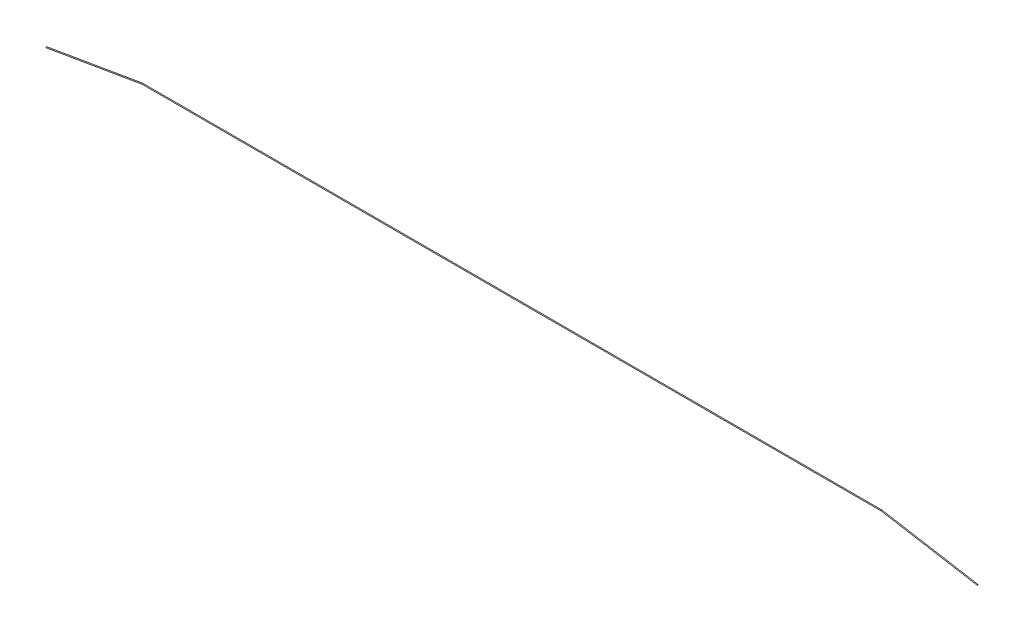
ISO-10303-21;
HEADER;
FILE_DESCRIPTION(('STEP AP214'),'2;1');
FILE_NAME('part.step','',(''),(''),'','','');
FILE_SCHEMA(('AUTOMOTIVE_DESIGN { 1 0 10303 214 1 1 1 1 }'));
ENDSEC;
DATA;
#1=APPLICATION_CONTEXT('core data for automotive mechanical design processes');
#2=APPLICATION_PROTOCOL_DEFINITION('international standard','automotive_design',2000,#1);
#3=PRODUCT_CONTEXT('',#1,'mechanical');
#4=PRODUCT('Part','Part','',(#3));
#5=PRODUCT_RELATED_PRODUCT_CATEGORY('part','',(#4));
#6=PRODUCT_DEFINITION_FORMATION('','',#4);
#7=PRODUCT_DEFINITION_CONTEXT('part definition',#1,'design');
#8=PRODUCT_DEFINITION('design','',#6,#7);
#9=PRODUCT_DEFINITION_SHAPE('','',#8);
#10=(LENGTH_UNIT() NAMED_UNIT(*) SI_UNIT(.MILLI.,.METRE.));
#11=(NAMED_UNIT(*) PLANE_ANGLE_UNIT() SI_UNIT($,.RADIAN.));
#12=(NAMED_UNIT(*) SI_UNIT($,.STERADIAN.) SOLID_ANGLE_UNIT());
#13=UNCERTAINTY_MEASURE_WITH_UNIT(LENGTH_MEASURE(1.E-05),#10,'distance_accuracy_value','');
#14=(GEOMETRIC_REPRESENTATION_CONTEXT(3) GLOBAL_UNCERTAINTY_ASSIGNED_CONTEXT((#13)) GLOBAL_UNIT_ASSIGNED_CONTEXT((#10,
#11,#12)) REPRESENTATION_CONTEXT('',''));
#15=CARTESIAN_POINT('',(0.,0.,0.));
#16=DIRECTION('',(0.,0.,1.));
#17=DIRECTION('',(1.,0.,0.));
#18=AXIS2_PLACEMENT_3D('',#15,#16,#17);
#19=CARTESIAN_POINT('',(-27.18990625,23.6140625,0.));
#20=DIRECTION('',(0.985722753293324,0.168376523422446,0.));
#21=DIRECTION('',(-0.168376523422446,0.985722753293324,0.));
#22=AXIS2_PLACEMENT_3D('',#19,#20,#21);
#23=PLANE('',#22);
#24=CARTESIAN_POINT('',(-27.18990625,23.6140625,0.));
#25=DIRECTION('',(0.985722753293324,0.168376523422446,0.));
#26=DIRECTION('',(-0.168376523422446,0.985722753293324,0.));
#27=AXIS2_PLACEMENT_3D('',#24,#25,#26);
#28=CIRCLE('',#27,0.0254);
#29=CARTESIAN_POINT('',(-27.1941830136949,23.6390998579336,0.));
#30=VERTEX_POINT('',#29);
#31=EDGE_CURVE('E60',#30,#30,#28,.T.);
#32=ORIENTED_EDGE('',*,*,#31,.F.);
#33=EDGE_LOOP('',(#32));
#34=FACE_BOUND('',#33,.T.);
#35=ADVANCED_FACE('F45',(#34),#23,.F.);
#36=CARTESIAN_POINT('',(27.18990625,23.6140625,0.));
#37=DIRECTION('',(0.985722753293324,-0.168376523422448,0.));
#38=DIRECTION('',(0.168376523422448,0.985722753293324,0.));
#39=AXIS2_PLACEMENT_3D('',#36,#37,#38);
#40=PLANE('',#39);
#41=CARTESIAN_POINT('',(27.18990625,23.6140625,0.));
#42=DIRECTION('',(0.985722753293324,-0.168376523422448,0.));
#43=DIRECTION('',(0.168376523422448,0.985722753293324,0.));
#44=AXIS2_PLACEMENT_3D('',#41,#42,#43);
#45=CIRCLE('',#44,0.0254);
#46=CARTESIAN_POINT('',(27.1941830136949,23.6390998579337,0.));
#47=VERTEX_POINT('',#46);
#48=EDGE_CURVE('E54',#47,#47,#45,.T.);
#49=ORIENTED_EDGE('',*,*,#48,.T.);
#50=EDGE_LOOP('',(#49));
#51=FACE_BOUND('',#50,.T.);
#52=ADVANCED_FACE('F123',(#51),#40,.T.);
#53=CARTESIAN_POINT('',(-21.59,24.5706121410795,0.));
#54=DIRECTION('',(-0.985722753293323,-0.168376523422447,0.));
#55=DIRECTION('',(0.168376523422447,-0.985722753293323,0.));
#56=AXIS2_PLACEMENT_3D('',#53,#54,#55);
#57=CYLINDRICAL_SURFACE('',#56,0.0254);
#58=ORIENTED_EDGE('',*,*,#31,.T.);
#59=EDGE_LOOP('',(#58));
#60=FACE_BOUND('',#59,.T.);
#61=CARTESIAN_POINT('',(-21.59,24.5706121410795,0.));
#62=DIRECTION('',(1.,0.,0.));
#63=DIRECTION('',(0.,1.,0.));
#64=AXIS2_PLACEMENT_3D('',#61,#62,#63);
#65=CIRCLE('',#64,0.0254);
#66=CARTESIAN_POINT('',(-21.5921383818475,24.5958308200463,0.));
#67=VERTEX_POINT('',#66);
#68=EDGE_CURVE('E48',#67,#67,#65,.T.);
#69=ORIENTED_EDGE('',*,*,#68,.F.);
#70=EDGE_LOOP('',(#69));
#71=FACE_BOUND('',#70,.T.);
#72=ADVANCED_FACE('F97',(#60,#71),#57,.T.);
#73=CARTESIAN_POINT('',(21.59,24.5706121410795,0.));
#74=DIRECTION('',(-1.,0.,0.));
#75=DIRECTION('',(0.,0.,1.));
#76=AXIS2_PLACEMENT_3D('',#73,#74,#75);
#77=CYLINDRICAL_SURFACE('',#76,0.0254);
#78=ORIENTED_EDGE('',*,*,#68,.T.);
#79=EDGE_LOOP('',(#78));
#80=FACE_BOUND('',#79,.T.);
#81=CARTESIAN_POINT('',(21.59,24.5706121410795,0.));
#82=DIRECTION('',(0.985722753293324,-0.168376523422448,0.));
#83=DIRECTION('',(0.168376523422448,0.985722753293324,0.));
#84=AXIS2_PLACEMENT_3D('',#81,#82,#83);
#85=CIRCLE('',#84,0.0254);
#86=CARTESIAN_POINT('',(21.5921383818474,24.5958308200463,0.));
#87=VERTEX_POINT('',#86);
#88=EDGE_CURVE('E12',#87,#87,#85,.T.);
#89=ORIENTED_EDGE('',*,*,#88,.F.);
#90=EDGE_LOOP('',(#89));
#91=FACE_BOUND('',#90,.T.);
#92=ADVANCED_FACE('F93',(#80,#91),#77,.T.);
#93=CARTESIAN_POINT('',(27.18990625,23.6140625,0.));
#94=DIRECTION('',(-0.985722753293323,0.168376523422447,0.));
#95=DIRECTION('',(-0.168376523422447,-0.985722753293323,0.));
#96=AXIS2_PLACEMENT_3D('',#93,#94,#95);
#97=CYLINDRICAL_SURFACE('',#96,0.0254);
#98=ORIENTED_EDGE('',*,*,#88,.T.);
#99=EDGE_LOOP('',(#98));
#100=FACE_BOUND('',#99,.T.);
#101=ORIENTED_EDGE('',*,*,#48,.F.);
#102=EDGE_LOOP('',(#101));
#103=FACE_BOUND('',#102,.T.);
#104=ADVANCED_FACE('F73',(#100,#103),#97,.T.);
#105=CLOSED_SHELL('',(#35,#52,#72,#92,#104));
#106=MANIFOLD_SOLID_BREP('B2',#105);
#107=ADVANCED_BREP_SHAPE_REPRESENTATION('',(#18,#106),#14);
#108=SHAPE_DEFINITION_REPRESENTATION(#9,#107);
ENDSEC;
END-ISO-10303-21;
